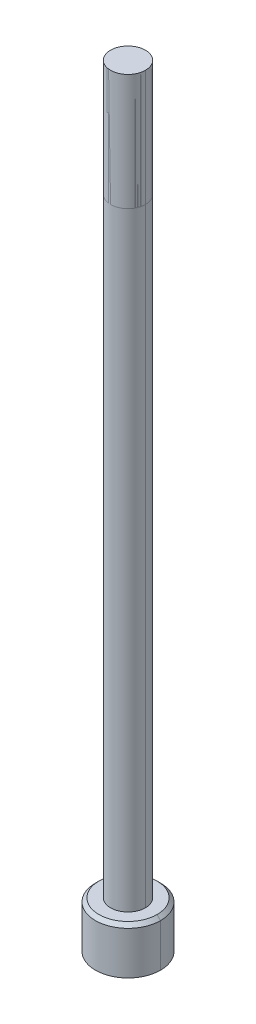
ISO-10303-21;
HEADER;
FILE_DESCRIPTION(('STEP AP214'),'2;1');
FILE_NAME('part.step','',(''),(''),'','','');
FILE_SCHEMA(('AUTOMOTIVE_DESIGN { 1 0 10303 214 1 1 1 1 }'));
ENDSEC;
DATA;
#1=APPLICATION_CONTEXT('core data for automotive mechanical design processes');
#2=APPLICATION_PROTOCOL_DEFINITION('international standard','automotive_design',2000,#1);
#3=PRODUCT_CONTEXT('',#1,'mechanical');
#4=PRODUCT('Part','Part','',(#3));
#5=PRODUCT_RELATED_PRODUCT_CATEGORY('part','',(#4));
#6=PRODUCT_DEFINITION_FORMATION('','',#4);
#7=PRODUCT_DEFINITION_CONTEXT('part definition',#1,'design');
#8=PRODUCT_DEFINITION('design','',#6,#7);
#9=PRODUCT_DEFINITION_SHAPE('','',#8);
#10=(LENGTH_UNIT() NAMED_UNIT(*) SI_UNIT(.MILLI.,.METRE.));
#11=(NAMED_UNIT(*) PLANE_ANGLE_UNIT() SI_UNIT($,.RADIAN.));
#12=(NAMED_UNIT(*) SI_UNIT($,.STERADIAN.) SOLID_ANGLE_UNIT());
#13=UNCERTAINTY_MEASURE_WITH_UNIT(LENGTH_MEASURE(1.E-05),#10,'distance_accuracy_value','');
#14=(GEOMETRIC_REPRESENTATION_CONTEXT(3) GLOBAL_UNCERTAINTY_ASSIGNED_CONTEXT((#13)) GLOBAL_UNIT_ASSIGNED_CONTEXT((#10,
#11,#12)) REPRESENTATION_CONTEXT('',''));
#15=CARTESIAN_POINT('',(0.,0.,0.));
#16=DIRECTION('',(0.,0.,1.));
#17=DIRECTION('',(1.,0.,0.));
#18=AXIS2_PLACEMENT_3D('',#15,#16,#17);
#19=CARTESIAN_POINT('',(0.,75.7,0.));
#20=DIRECTION('',(0.,1.,0.));
#21=DIRECTION('',(-1.,0.,0.));
#22=AXIS2_PLACEMENT_3D('',#19,#20,#21);
#23=CYLINDRICAL_SURFACE('',#22,1.5);
#24=CARTESIAN_POINT('',(-1.5,65.7,0.));
#25=DIRECTION('',(0.,1.,0.));
#26=VECTOR('',#25,1.);
#27=LINE('',#24,#26);
#28=CARTESIAN_POINT('',(-1.5,65.7,0.));
#29=VERTEX_POINT('',#28);
#30=CARTESIAN_POINT('',(-1.5,75.7,0.));
#31=VERTEX_POINT('',#30);
#32=EDGE_CURVE('P0_E27',#29,#31,#27,.T.);
#33=ORIENTED_EDGE('',*,*,#32,.T.);
#34=CARTESIAN_POINT('',(0.,75.7,0.));
#35=DIRECTION('',(0.,-1.,0.));
#36=DIRECTION('',(-1.,0.,0.));
#37=AXIS2_PLACEMENT_3D('',#34,#35,#36);
#38=CIRCLE('',#37,1.5);
#39=CARTESIAN_POINT('',(1.5,75.7,0.));
#40=VERTEX_POINT('',#39);
#41=EDGE_CURVE('P0_E11',#31,#40,#38,.T.);
#42=ORIENTED_EDGE('',*,*,#41,.T.);
#43=CARTESIAN_POINT('',(1.5,75.7,0.));
#44=DIRECTION('',(0.,-1.,0.));
#45=VECTOR('',#44,1.);
#46=LINE('',#43,#45);
#47=CARTESIAN_POINT('',(1.5,65.7,0.));
#48=VERTEX_POINT('',#47);
#49=EDGE_CURVE('P0_E46',#40,#48,#46,.T.);
#50=ORIENTED_EDGE('',*,*,#49,.T.);
#51=CARTESIAN_POINT('',(0.,65.7,0.));
#52=DIRECTION('',(0.,1.,0.));
#53=DIRECTION('',(1.,0.,0.));
#54=AXIS2_PLACEMENT_3D('',#51,#52,#53);
#55=CIRCLE('',#54,1.5);
#56=EDGE_CURVE('P0_E53',#48,#29,#55,.T.);
#57=ORIENTED_EDGE('',*,*,#56,.T.);
#58=EDGE_LOOP('',(#33,#42,#50,#57));
#59=FACE_BOUND('',#58,.T.);
#60=ADVANCED_FACE('P0_F16',(#59),#23,.T.);
#61=CARTESIAN_POINT('',(0.,75.7,0.));
#62=DIRECTION('',(0.,1.,0.));
#63=DIRECTION('',(-1.,0.,0.));
#64=AXIS2_PLACEMENT_3D('',#61,#62,#63);
#65=CYLINDRICAL_SURFACE('',#64,1.5);
#66=ORIENTED_EDGE('',*,*,#49,.F.);
#67=CARTESIAN_POINT('',(0.,75.7,0.));
#68=DIRECTION('',(0.,-1.,0.));
#69=DIRECTION('',(1.,0.,0.));
#70=AXIS2_PLACEMENT_3D('',#67,#68,#69);
#71=CIRCLE('',#70,1.5);
#72=EDGE_CURVE('P0_E34',#40,#31,#71,.T.);
#73=ORIENTED_EDGE('',*,*,#72,.T.);
#74=ORIENTED_EDGE('',*,*,#32,.F.);
#75=CARTESIAN_POINT('',(0.,65.7,0.));
#76=DIRECTION('',(0.,1.,0.));
#77=DIRECTION('',(-1.,0.,0.));
#78=AXIS2_PLACEMENT_3D('',#75,#76,#77);
#79=CIRCLE('',#78,1.5);
#80=EDGE_CURVE('P0_E42',#29,#48,#79,.T.);
#81=ORIENTED_EDGE('',*,*,#80,.T.);
#82=EDGE_LOOP('',(#66,#73,#74,#81));
#83=FACE_BOUND('',#82,.T.);
#84=ADVANCED_FACE('P0_F48',(#83),#65,.T.);
#85=CARTESIAN_POINT('',(0.,65.7,0.));
#86=DIRECTION('',(0.,1.,0.));
#87=DIRECTION('',(1.,0.,0.));
#88=AXIS2_PLACEMENT_3D('',#85,#86,#87);
#89=PLANE('',#88);
#90=ORIENTED_EDGE('',*,*,#80,.F.);
#91=ORIENTED_EDGE('',*,*,#56,.F.);
#92=EDGE_LOOP('',(#90,#91));
#93=FACE_BOUND('',#92,.T.);
#94=ADVANCED_FACE('P0_F17',(#93),#89,.F.);
#95=OPEN_SHELL('',(#60,#84,#94));
#96=SHELL_BASED_SURFACE_MODEL('P0_B1',(#95));
#97=CARTESIAN_POINT('',(-12.02,12.,0.));
#98=DIRECTION('',(0.,-1.,0.));
#99=DIRECTION('',(0.,0.,-1.));
#100=AXIS2_PLACEMENT_3D('',#97,#98,#99);
#101=PLANE('',#100);
#102=DIRECTION('',(-0.866025403784429,0.,-0.500000000000017));
#103=VECTOR('',#102,1.);
#104=CARTESIAN_POINT('',(0.,12.,1.443375672974));
#105=LINE('',#104,#103);
#106=CARTESIAN_POINT('',(0.,12.,1.443375672974));
#107=VERTEX_POINT('',#106);
#108=CARTESIAN_POINT('',(-1.25,12.,0.721687836487));
#109=VERTEX_POINT('',#108);
#110=EDGE_CURVE('P1_E11',#107,#109,#105,.T.);
#111=ORIENTED_EDGE('',*,*,#110,.T.);
#112=DIRECTION('',(0.,0.,-1.));
#113=VECTOR('',#112,1.);
#114=CARTESIAN_POINT('',(-1.25,12.,0.721687836487));
#115=LINE('',#114,#113);
#116=CARTESIAN_POINT('',(-1.25,12.,-0.721687836487));
#117=VERTEX_POINT('',#116);
#118=EDGE_CURVE('P1_E169',#109,#117,#115,.T.);
#119=ORIENTED_EDGE('',*,*,#118,.T.);
#120=DIRECTION('',(0.866025403784429,0.,-0.500000000000017));
#121=VECTOR('',#120,1.);
#122=CARTESIAN_POINT('',(-1.25,12.,-0.721687836487));
#123=LINE('',#122,#121);
#124=CARTESIAN_POINT('',(0.,12.,-1.443375672974));
#125=VERTEX_POINT('',#124);
#126=EDGE_CURVE('P1_E170',#117,#125,#123,.T.);
#127=ORIENTED_EDGE('',*,*,#126,.T.);
#128=DIRECTION('',(0.866025403784429,0.,0.500000000000017));
#129=VECTOR('',#128,1.);
#130=CARTESIAN_POINT('',(0.,12.,-1.443375672974));
#131=LINE('',#130,#129);
#132=CARTESIAN_POINT('',(1.25,12.,-0.721687836487));
#133=VERTEX_POINT('',#132);
#134=EDGE_CURVE('P1_E133',#125,#133,#131,.T.);
#135=ORIENTED_EDGE('',*,*,#134,.T.);
#136=DIRECTION('',(0.,0.,1.));
#137=VECTOR('',#136,1.);
#138=CARTESIAN_POINT('',(1.25,12.,-0.721687836487));
#139=LINE('',#138,#137);
#140=CARTESIAN_POINT('',(1.25,12.,0.721687836487));
#141=VERTEX_POINT('',#140);
#142=EDGE_CURVE('P1_E129',#133,#141,#139,.T.);
#143=ORIENTED_EDGE('',*,*,#142,.T.);
#144=DIRECTION('',(-0.866025403784429,0.,0.500000000000017));
#145=VECTOR('',#144,1.);
#146=CARTESIAN_POINT('',(1.25,12.,0.721687836487));
#147=LINE('',#146,#145);
#148=EDGE_CURVE('P1_E164',#141,#107,#147,.T.);
#149=ORIENTED_EDGE('',*,*,#148,.T.);
#150=EDGE_LOOP('',(#111,#119,#127,#135,#143,#149));
#151=FACE_BOUND('',#150,.T.);
#152=ADVANCED_FACE('P1_F16',(#151),#101,.T.);
#153=CARTESIAN_POINT('',(0.,9.3,1.443375672974));
#154=DIRECTION('',(-0.500000000000017,0.,0.866025403784429));
#155=DIRECTION('',(0.,1.,0.));
#156=AXIS2_PLACEMENT_3D('',#153,#154,#155);
#157=PLANE('',#156);
#158=DIRECTION('',(0.,1.,0.));
#159=VECTOR('',#158,1.);
#160=CARTESIAN_POINT('',(-1.25,9.3,0.721687836487));
#161=LINE('',#160,#159);
#162=CARTESIAN_POINT('',(-1.25,9.3,0.721687836487));
#163=VERTEX_POINT('',#162);
#164=EDGE_CURVE('P1_E27',#163,#109,#161,.T.);
#165=ORIENTED_EDGE('',*,*,#164,.T.);
#166=ORIENTED_EDGE('',*,*,#110,.F.);
#167=DIRECTION('',(0.,1.,0.));
#168=VECTOR('',#167,1.);
#169=CARTESIAN_POINT('',(0.,9.3,1.443375672974));
#170=LINE('',#169,#168);
#171=CARTESIAN_POINT('',(0.,9.3,1.443375672974));
#172=VERTEX_POINT('',#171);
#173=EDGE_CURVE('P1_E161',#172,#107,#170,.T.);
#174=ORIENTED_EDGE('',*,*,#173,.F.);
#175=DIRECTION('',(-0.866025403784429,0.,-0.500000000000017));
#176=VECTOR('',#175,1.);
#177=CARTESIAN_POINT('',(0.,9.3,1.443375672974));
#178=LINE('',#177,#176);
#179=EDGE_CURVE('P1_E200',#172,#163,#178,.T.);
#180=ORIENTED_EDGE('',*,*,#179,.T.);
#181=EDGE_LOOP('',(#165,#166,#174,#180));
#182=FACE_BOUND('',#181,.T.);
#183=ADVANCED_FACE('P1_F282',(#182),#157,.F.);
#184=CARTESIAN_POINT('',(-1.25,9.3,0.721687836487));
#185=DIRECTION('',(-1.,0.,0.));
#186=DIRECTION('',(0.,0.,1.));
#187=AXIS2_PLACEMENT_3D('',#184,#185,#186);
#188=PLANE('',#187);
#189=DIRECTION('',(0.,1.,0.));
#190=VECTOR('',#189,1.);
#191=CARTESIAN_POINT('',(-1.25,9.3,-0.721687836487));
#192=LINE('',#191,#190);
#193=CARTESIAN_POINT('',(-1.25,9.3,-0.721687836487));
#194=VERTEX_POINT('',#193);
#195=EDGE_CURVE('P1_E165',#194,#117,#192,.T.);
#196=ORIENTED_EDGE('',*,*,#195,.T.);
#197=ORIENTED_EDGE('',*,*,#118,.F.);
#198=ORIENTED_EDGE('',*,*,#164,.F.);
#199=DIRECTION('',(0.,0.,-1.));
#200=VECTOR('',#199,1.);
#201=CARTESIAN_POINT('',(-1.25,9.3,0.721687836487));
#202=LINE('',#201,#200);
#203=EDGE_CURVE('P1_E193',#163,#194,#202,.T.);
#204=ORIENTED_EDGE('',*,*,#203,.T.);
#205=EDGE_LOOP('',(#196,#197,#198,#204));
#206=FACE_BOUND('',#205,.T.);
#207=ADVANCED_FACE('P1_F281',(#206),#188,.F.);
#208=CARTESIAN_POINT('',(-1.25,9.3,-0.721687836487));
#209=DIRECTION('',(-0.500000000000017,0.,-0.866025403784429));
#210=DIRECTION('',(-0.866025403784429,0.,0.500000000000017));
#211=AXIS2_PLACEMENT_3D('',#208,#209,#210);
#212=PLANE('',#211);
#213=DIRECTION('',(0.,1.,0.));
#214=VECTOR('',#213,1.);
#215=CARTESIAN_POINT('',(0.,9.3,-1.443375672974));
#216=LINE('',#215,#214);
#217=CARTESIAN_POINT('',(0.,9.3,-1.443375672974));
#218=VERTEX_POINT('',#217);
#219=EDGE_CURVE('P1_E139',#218,#125,#216,.T.);
#220=ORIENTED_EDGE('',*,*,#219,.T.);
#221=ORIENTED_EDGE('',*,*,#126,.F.);
#222=ORIENTED_EDGE('',*,*,#195,.F.);
#223=DIRECTION('',(0.866025403784429,0.,-0.500000000000017));
#224=VECTOR('',#223,1.);
#225=CARTESIAN_POINT('',(-1.25,9.3,-0.721687836487));
#226=LINE('',#225,#224);
#227=EDGE_CURVE('P1_E144',#194,#218,#226,.T.);
#228=ORIENTED_EDGE('',*,*,#227,.T.);
#229=EDGE_LOOP('',(#220,#221,#222,#228));
#230=FACE_BOUND('',#229,.T.);
#231=ADVANCED_FACE('P1_F270',(#230),#212,.F.);
#232=CARTESIAN_POINT('',(0.,9.3,-1.443375672974));
#233=DIRECTION('',(0.500000000000017,0.,-0.866025403784429));
#234=DIRECTION('',(0.,-1.,0.));
#235=AXIS2_PLACEMENT_3D('',#232,#233,#234);
#236=PLANE('',#235);
#237=DIRECTION('',(0.,1.,0.));
#238=VECTOR('',#237,1.);
#239=CARTESIAN_POINT('',(1.25,9.3,-0.721687836487));
#240=LINE('',#239,#238);
#241=CARTESIAN_POINT('',(1.25,9.3,-0.721687836487));
#242=VERTEX_POINT('',#241);
#243=EDGE_CURVE('P1_E124',#242,#133,#240,.T.);
#244=ORIENTED_EDGE('',*,*,#243,.T.);
#245=ORIENTED_EDGE('',*,*,#134,.F.);
#246=ORIENTED_EDGE('',*,*,#219,.F.);
#247=DIRECTION('',(0.866025403784429,0.,0.500000000000017));
#248=VECTOR('',#247,1.);
#249=CARTESIAN_POINT('',(0.,9.3,-1.443375672974));
#250=LINE('',#249,#248);
#251=EDGE_CURVE('P1_E136',#218,#242,#250,.T.);
#252=ORIENTED_EDGE('',*,*,#251,.T.);
#253=EDGE_LOOP('',(#244,#245,#246,#252));
#254=FACE_BOUND('',#253,.T.);
#255=ADVANCED_FACE('P1_F137',(#254),#236,.F.);
#256=CARTESIAN_POINT('',(1.25,9.3,-0.721687836487));
#257=DIRECTION('',(1.,0.,0.));
#258=DIRECTION('',(0.,1.,0.));
#259=AXIS2_PLACEMENT_3D('',#256,#257,#258);
#260=PLANE('',#259);
#261=DIRECTION('',(0.,1.,0.));
#262=VECTOR('',#261,1.);
#263=CARTESIAN_POINT('',(1.25,9.3,0.721687836487));
#264=LINE('',#263,#262);
#265=CARTESIAN_POINT('',(1.25,9.3,0.721687836487));
#266=VERTEX_POINT('',#265);
#267=EDGE_CURVE('P1_E115',#266,#141,#264,.T.);
#268=ORIENTED_EDGE('',*,*,#267,.T.);
#269=ORIENTED_EDGE('',*,*,#142,.F.);
#270=ORIENTED_EDGE('',*,*,#243,.F.);
#271=DIRECTION('',(0.,0.,1.));
#272=VECTOR('',#271,1.);
#273=CARTESIAN_POINT('',(1.25,9.3,-0.721687836487));
#274=LINE('',#273,#272);
#275=EDGE_CURVE('P1_E128',#242,#266,#274,.T.);
#276=ORIENTED_EDGE('',*,*,#275,.T.);
#277=EDGE_LOOP('',(#268,#269,#270,#276));
#278=FACE_BOUND('',#277,.T.);
#279=ADVANCED_FACE('P1_F126',(#278),#260,.F.);
#280=CARTESIAN_POINT('',(1.25,9.3,0.721687836487));
#281=DIRECTION('',(0.500000000000017,0.,0.866025403784429));
#282=DIRECTION('',(0.,-1.,0.));
#283=AXIS2_PLACEMENT_3D('',#280,#281,#282);
#284=PLANE('',#283);
#285=ORIENTED_EDGE('',*,*,#173,.T.);
#286=ORIENTED_EDGE('',*,*,#148,.F.);
#287=ORIENTED_EDGE('',*,*,#267,.F.);
#288=DIRECTION('',(-0.866025403784429,0.,0.500000000000017));
#289=VECTOR('',#288,1.);
#290=CARTESIAN_POINT('',(1.25,9.3,0.721687836487));
#291=LINE('',#290,#289);
#292=EDGE_CURVE('P1_E149',#266,#172,#291,.T.);
#293=ORIENTED_EDGE('',*,*,#292,.T.);
#294=EDGE_LOOP('',(#285,#286,#287,#293));
#295=FACE_BOUND('',#294,.T.);
#296=ADVANCED_FACE('P1_F18',(#295),#284,.F.);
#297=CARTESIAN_POINT('',(0.,0.,0.));
#298=DIRECTION('',(0.,1.,0.));
#299=DIRECTION('',(1.,0.,0.));
#300=AXIS2_PLACEMENT_3D('',#297,#298,#299);
#301=CYLINDRICAL_SURFACE('',#300,2.8);
#302=DIRECTION('',(1.036032519961E-09,1.,-5.150842697467E-09));
#303=VECTOR('',#302,1.);
#304=CARTESIAN_POINT('',(-2.8,9.3,0.));
#305=LINE('',#304,#303);
#306=CARTESIAN_POINT('',(-2.8,9.3,0.));
#307=VERTEX_POINT('',#306);
#308=CARTESIAN_POINT('',(-2.8,13.,0.));
#309=VERTEX_POINT('',#308);
#310=EDGE_CURVE('P1_E179',#307,#309,#305,.T.);
#311=ORIENTED_EDGE('',*,*,#310,.T.);
#312=CARTESIAN_POINT('',(0.,13.,0.));
#313=DIRECTION('',(0.,1.,0.));
#314=DIRECTION('',(1.,0.,0.));
#315=AXIS2_PLACEMENT_3D('',#312,#313,#314);
#316=CIRCLE('',#315,2.8);
#317=CARTESIAN_POINT('',(2.8,13.,0.));
#318=VERTEX_POINT('',#317);
#319=EDGE_CURVE('P1_E190',#318,#309,#316,.T.);
#320=ORIENTED_EDGE('',*,*,#319,.F.);
#321=DIRECTION('',(-1.036032519961E-09,1.,5.150842601736E-09));
#322=VECTOR('',#321,1.);
#323=CARTESIAN_POINT('',(2.8,9.3,0.));
#324=LINE('',#323,#322);
#325=CARTESIAN_POINT('',(2.8,9.3,0.));
#326=VERTEX_POINT('',#325);
#327=EDGE_CURVE('P1_E199',#326,#318,#324,.T.);
#328=ORIENTED_EDGE('',*,*,#327,.F.);
#329=CARTESIAN_POINT('',(0.,9.3,0.));
#330=DIRECTION('',(0.,1.,0.));
#331=DIRECTION('',(1.,0.,0.));
#332=AXIS2_PLACEMENT_3D('',#329,#330,#331);
#333=CIRCLE('',#332,2.8);
#334=EDGE_CURVE('P1_E151',#326,#307,#333,.T.);
#335=ORIENTED_EDGE('',*,*,#334,.T.);
#336=EDGE_LOOP('',(#311,#320,#328,#335));
#337=FACE_BOUND('',#336,.T.);
#338=ADVANCED_FACE('P1_F324',(#337),#301,.T.);
#339=CARTESIAN_POINT('',(-12.02,9.3,0.));
#340=DIRECTION('',(0.,-1.,0.));
#341=DIRECTION('',(0.,0.,-1.));
#342=AXIS2_PLACEMENT_3D('',#339,#340,#341);
#343=PLANE('',#342);
#344=ORIENTED_EDGE('',*,*,#275,.F.);
#345=ORIENTED_EDGE('',*,*,#251,.F.);
#346=ORIENTED_EDGE('',*,*,#227,.F.);
#347=ORIENTED_EDGE('',*,*,#203,.F.);
#348=ORIENTED_EDGE('',*,*,#179,.F.);
#349=ORIENTED_EDGE('',*,*,#292,.F.);
#350=EDGE_LOOP('',(#344,#345,#346,#347,#348,#349));
#351=FACE_BOUND('',#350,.T.);
#352=CARTESIAN_POINT('',(0.,9.3,0.));
#353=DIRECTION('',(0.,1.,0.));
#354=DIRECTION('',(-1.,0.,0.));
#355=AXIS2_PLACEMENT_3D('',#352,#353,#354);
#356=CIRCLE('',#355,2.8);
#357=EDGE_CURVE('P1_E157',#307,#326,#356,.T.);
#358=ORIENTED_EDGE('',*,*,#357,.F.);
#359=ORIENTED_EDGE('',*,*,#334,.F.);
#360=EDGE_LOOP('',(#358,#359));
#361=FACE_BOUND('',#360,.T.);
#362=ADVANCED_FACE('P1_F146',(#351,#361),#343,.T.);
#363=CARTESIAN_POINT('',(0.,0.,0.));
#364=DIRECTION('',(0.,1.,0.));
#365=DIRECTION('',(1.,0.,0.));
#366=AXIS2_PLACEMENT_3D('',#363,#364,#365);
#367=CYLINDRICAL_SURFACE('',#366,2.8);
#368=ORIENTED_EDGE('',*,*,#327,.T.);
#369=CARTESIAN_POINT('',(0.,13.,0.));
#370=DIRECTION('',(0.,1.,0.));
#371=DIRECTION('',(-1.,0.,0.));
#372=AXIS2_PLACEMENT_3D('',#369,#370,#371);
#373=CIRCLE('',#372,2.8);
#374=EDGE_CURVE('P1_E189',#309,#318,#373,.T.);
#375=ORIENTED_EDGE('',*,*,#374,.F.);
#376=ORIENTED_EDGE('',*,*,#310,.F.);
#377=ORIENTED_EDGE('',*,*,#357,.T.);
#378=EDGE_LOOP('',(#368,#375,#376,#377));
#379=FACE_BOUND('',#378,.T.);
#380=ADVANCED_FACE('P1_F304',(#379),#367,.T.);
#381=CARTESIAN_POINT('',(0.,13.15000000353,0.));
#382=DIRECTION('',(0.,-1.,0.));
#383=DIRECTION('',(0.,0.,-1.));
#384=AXIS2_PLACEMENT_3D('',#381,#382,#383);
#385=CONICAL_SURFACE('',#384,2.64999999647,0.7853981633973);
#386=DIRECTION('',(-0.707106781186598,-0.707106781186498,8.55626964087997E-09));
#387=VECTOR('',#386,1.);
#388=CARTESIAN_POINT('',(-2.499999995437,13.30000000456,-2.268823612295E-08));
#389=LINE('',#388,#387);
#390=CARTESIAN_POINT('',(-2.5,13.3,0.));
#391=VERTEX_POINT('',#390);
#392=EDGE_CURVE('P1_E185',#391,#309,#389,.T.);
#393=ORIENTED_EDGE('',*,*,#392,.T.);
#394=ORIENTED_EDGE('',*,*,#374,.T.);
#395=DIRECTION('',(0.707106781186598,-0.707106781186498,-8.55626863399997E-09));
#396=VECTOR('',#395,1.);
#397=CARTESIAN_POINT('',(2.499999995437,13.30000000456,2.268823559618E-08));
#398=LINE('',#397,#396);
#399=CARTESIAN_POINT('',(2.5,13.3,0.));
#400=VERTEX_POINT('',#399);
#401=EDGE_CURVE('P1_E211',#400,#318,#398,.T.);
#402=ORIENTED_EDGE('',*,*,#401,.F.);
#403=CARTESIAN_POINT('',(0.,13.3,0.));
#404=DIRECTION('',(0.,1.,0.));
#405=DIRECTION('',(-1.,0.,0.));
#406=AXIS2_PLACEMENT_3D('',#403,#404,#405);
#407=CIRCLE('',#406,2.5);
#408=EDGE_CURVE('P1_E217',#391,#400,#407,.T.);
#409=ORIENTED_EDGE('',*,*,#408,.F.);
#410=EDGE_LOOP('',(#393,#394,#402,#409));
#411=FACE_BOUND('',#410,.T.);
#412=ADVANCED_FACE('P1_F296',(#411),#385,.T.);
#413=CARTESIAN_POINT('',(0.,13.15000000353,0.));
#414=DIRECTION('',(0.,-1.,0.));
#415=DIRECTION('',(0.,0.,-1.));
#416=AXIS2_PLACEMENT_3D('',#413,#414,#415);
#417=CONICAL_SURFACE('',#416,2.64999999647,0.7853981633973);
#418=ORIENTED_EDGE('',*,*,#401,.T.);
#419=ORIENTED_EDGE('',*,*,#319,.T.);
#420=ORIENTED_EDGE('',*,*,#392,.F.);
#421=CARTESIAN_POINT('',(0.,13.3,0.));
#422=DIRECTION('',(0.,1.,0.));
#423=DIRECTION('',(1.,0.,0.));
#424=AXIS2_PLACEMENT_3D('',#421,#422,#423);
#425=CIRCLE('',#424,2.5);
#426=EDGE_CURVE('P1_E208',#400,#391,#425,.T.);
#427=ORIENTED_EDGE('',*,*,#426,.F.);
#428=EDGE_LOOP('',(#418,#419,#420,#427));
#429=FACE_BOUND('',#428,.T.);
#430=ADVANCED_FACE('P1_F292',(#429),#417,.T.);
#431=CARTESIAN_POINT('',(0.,75.7,0.));
#432=DIRECTION('',(0.,1.,0.));
#433=DIRECTION('',(1.,0.,0.));
#434=AXIS2_PLACEMENT_3D('',#431,#432,#433);
#435=PLANE('',#434);
#436=CARTESIAN_POINT('',(0.,75.7,0.));
#437=DIRECTION('',(0.,1.,0.));
#438=DIRECTION('',(-1.,0.,0.));
#439=AXIS2_PLACEMENT_3D('',#436,#437,#438);
#440=CIRCLE('',#439,1.5);
#441=CARTESIAN_POINT('',(-1.5,75.7,0.));
#442=VERTEX_POINT('',#441);
#443=CARTESIAN_POINT('',(1.5,75.7,0.));
#444=VERTEX_POINT('',#443);
#445=EDGE_CURVE('P1_E175',#442,#444,#440,.T.);
#446=ORIENTED_EDGE('',*,*,#445,.T.);
#447=CARTESIAN_POINT('',(0.,75.7,0.));
#448=DIRECTION('',(0.,1.,0.));
#449=DIRECTION('',(1.,0.,0.));
#450=AXIS2_PLACEMENT_3D('',#447,#448,#449);
#451=CIRCLE('',#450,1.5);
#452=EDGE_CURVE('P1_E176',#444,#442,#451,.T.);
#453=ORIENTED_EDGE('',*,*,#452,.T.);
#454=EDGE_LOOP('',(#446,#453));
#455=FACE_BOUND('',#454,.T.);
#456=ADVANCED_FACE('P1_F295',(#455),#435,.T.);
#457=CARTESIAN_POINT('',(0.,0.,0.));
#458=DIRECTION('',(0.,1.,0.));
#459=DIRECTION('',(1.,0.,0.));
#460=AXIS2_PLACEMENT_3D('',#457,#458,#459);
#461=CYLINDRICAL_SURFACE('',#460,1.5);
#462=DIRECTION('',(0.,1.,0.));
#463=VECTOR('',#462,1.);
#464=CARTESIAN_POINT('',(1.5,13.3,0.));
#465=LINE('',#464,#463);
#466=CARTESIAN_POINT('',(1.5,13.3,0.));
#467=VERTEX_POINT('',#466);
#468=EDGE_CURVE('P1_E171',#467,#444,#465,.T.);
#469=ORIENTED_EDGE('',*,*,#468,.T.);
#470=ORIENTED_EDGE('',*,*,#445,.F.);
#471=DIRECTION('',(0.,1.,0.));
#472=VECTOR('',#471,1.);
#473=CARTESIAN_POINT('',(-1.5,13.3,0.));
#474=LINE('',#473,#472);
#475=CARTESIAN_POINT('',(-1.5,13.3,0.));
#476=VERTEX_POINT('',#475);
#477=EDGE_CURVE('P1_E181',#476,#442,#474,.T.);
#478=ORIENTED_EDGE('',*,*,#477,.F.);
#479=CARTESIAN_POINT('',(0.,13.3,0.));
#480=DIRECTION('',(0.,1.,0.));
#481=DIRECTION('',(-1.,0.,0.));
#482=AXIS2_PLACEMENT_3D('',#479,#480,#481);
#483=CIRCLE('',#482,1.5);
#484=EDGE_CURVE('P1_E204',#476,#467,#483,.T.);
#485=ORIENTED_EDGE('',*,*,#484,.T.);
#486=EDGE_LOOP('',(#469,#470,#478,#485));
#487=FACE_BOUND('',#486,.T.);
#488=ADVANCED_FACE('P1_F300',(#487),#461,.T.);
#489=CARTESIAN_POINT('',(0.,0.,0.));
#490=DIRECTION('',(0.,1.,0.));
#491=DIRECTION('',(1.,0.,0.));
#492=AXIS2_PLACEMENT_3D('',#489,#490,#491);
#493=CYLINDRICAL_SURFACE('',#492,1.5);
#494=ORIENTED_EDGE('',*,*,#477,.T.);
#495=ORIENTED_EDGE('',*,*,#452,.F.);
#496=ORIENTED_EDGE('',*,*,#468,.F.);
#497=CARTESIAN_POINT('',(0.,13.3,0.));
#498=DIRECTION('',(0.,1.,0.));
#499=DIRECTION('',(1.,0.,0.));
#500=AXIS2_PLACEMENT_3D('',#497,#498,#499);
#501=CIRCLE('',#500,1.5);
#502=EDGE_CURVE('P1_E20',#467,#476,#501,.T.);
#503=ORIENTED_EDGE('',*,*,#502,.T.);
#504=EDGE_LOOP('',(#494,#495,#496,#503));
#505=FACE_BOUND('',#504,.T.);
#506=ADVANCED_FACE('P1_F310',(#505),#493,.T.);
#507=CARTESIAN_POINT('',(0.,13.3,0.));
#508=DIRECTION('',(0.,1.,0.));
#509=DIRECTION('',(1.,0.,0.));
#510=AXIS2_PLACEMENT_3D('',#507,#508,#509);
#511=PLANE('',#510);
#512=ORIENTED_EDGE('',*,*,#484,.F.);
#513=ORIENTED_EDGE('',*,*,#502,.F.);
#514=EDGE_LOOP('',(#512,#513));
#515=FACE_BOUND('',#514,.T.);
#516=ORIENTED_EDGE('',*,*,#408,.T.);
#517=ORIENTED_EDGE('',*,*,#426,.T.);
#518=EDGE_LOOP('',(#516,#517));
#519=FACE_BOUND('',#518,.T.);
#520=ADVANCED_FACE('P1_F315',(#515,#519),#511,.T.);
#521=CLOSED_SHELL('',(#152,#183,#207,#231,#255,#279,#296,#338,#362,#380,#412,#430,#456,#488,
#506,#520));
#522=MANIFOLD_SOLID_BREP('P1_B1',#521);
#523=ADVANCED_BREP_SHAPE_REPRESENTATION('',(#18,#522),#14);
#524=MANIFOLD_SURFACE_SHAPE_REPRESENTATION('',(#18,#96),#14);
#525=SHAPE_REPRESENTATION('',(#18),#14);
#526=SHAPE_DEFINITION_REPRESENTATION(#9,#525);
#527=SHAPE_REPRESENTATION_RELATIONSHIP('','',#525,#523);
#528=SHAPE_REPRESENTATION_RELATIONSHIP('','',#525,#524);
ENDSEC;
END-ISO-10303-21;
